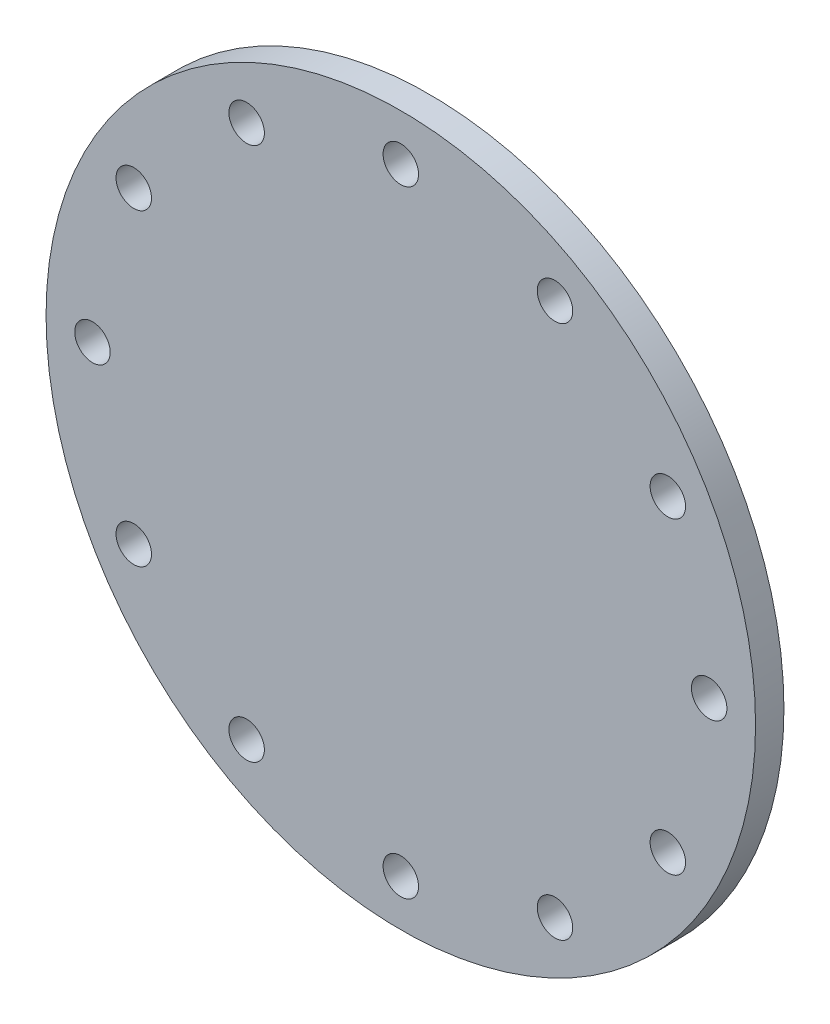
ISO-10303-21;
HEADER;
FILE_DESCRIPTION(('STEP AP214'),'2;1');
FILE_NAME('part.step','',(''),(''),'','','');
FILE_SCHEMA(('AUTOMOTIVE_DESIGN { 1 0 10303 214 1 1 1 1 }'));
ENDSEC;
DATA;
#1=APPLICATION_CONTEXT('core data for automotive mechanical design processes');
#2=APPLICATION_PROTOCOL_DEFINITION('international standard','automotive_design',2000,#1);
#3=PRODUCT_CONTEXT('',#1,'mechanical');
#4=PRODUCT('Part','Part','',(#3));
#5=PRODUCT_RELATED_PRODUCT_CATEGORY('part','',(#4));
#6=PRODUCT_DEFINITION_FORMATION('','',#4);
#7=PRODUCT_DEFINITION_CONTEXT('part definition',#1,'design');
#8=PRODUCT_DEFINITION('design','',#6,#7);
#9=PRODUCT_DEFINITION_SHAPE('','',#8);
#10=(LENGTH_UNIT() NAMED_UNIT(*) SI_UNIT(.MILLI.,.METRE.));
#11=(NAMED_UNIT(*) PLANE_ANGLE_UNIT() SI_UNIT($,.RADIAN.));
#12=(NAMED_UNIT(*) SI_UNIT($,.STERADIAN.) SOLID_ANGLE_UNIT());
#13=UNCERTAINTY_MEASURE_WITH_UNIT(LENGTH_MEASURE(1.E-05),#10,'distance_accuracy_value','');
#14=(GEOMETRIC_REPRESENTATION_CONTEXT(3) GLOBAL_UNCERTAINTY_ASSIGNED_CONTEXT((#13)) GLOBAL_UNIT_ASSIGNED_CONTEXT((#10,
#11,#12)) REPRESENTATION_CONTEXT('',''));
#15=CARTESIAN_POINT('',(0.,0.,0.));
#16=DIRECTION('',(0.,0.,1.));
#17=DIRECTION('',(1.,0.,0.));
#18=AXIS2_PLACEMENT_3D('',#15,#16,#17);
#19=CARTESIAN_POINT('',(0.,0.,20.));
#20=DIRECTION('',(0.,0.,1.));
#21=DIRECTION('',(1.,0.,0.));
#22=AXIS2_PLACEMENT_3D('',#19,#20,#21);
#23=PLANE('',#22);
#24=CARTESIAN_POINT('',(-188.179861477865,108.645693680294,20.));
#25=DIRECTION('',(0.,0.,1.));
#26=DIRECTION('',(1.,0.,0.));
#27=AXIS2_PLACEMENT_3D('',#24,#25,#26);
#28=CIRCLE('',#27,12.5000000000251);
#29=CARTESIAN_POINT('',(-175.67986147784,108.645693680294,20.));
#30=VERTEX_POINT('',#29);
#31=EDGE_CURVE('E100',#30,#30,#28,.T.);
#32=ORIENTED_EDGE('',*,*,#31,.F.);
#33=EDGE_LOOP('',(#32));
#34=FACE_BOUND('',#33,.T.);
#35=CARTESIAN_POINT('',(-188.179861477834,-108.645693680347,20.));
#36=DIRECTION('',(0.,0.,1.));
#37=DIRECTION('',(1.,0.,0.));
#38=AXIS2_PLACEMENT_3D('',#35,#36,#37);
#39=CIRCLE('',#38,12.500000000054);
#40=CARTESIAN_POINT('',(-175.67986147778,-108.645693680347,20.));
#41=VERTEX_POINT('',#40);
#42=EDGE_CURVE('E88',#41,#41,#39,.T.);
#43=ORIENTED_EDGE('',*,*,#42,.F.);
#44=EDGE_LOOP('',(#43));
#45=FACE_BOUND('',#44,.T.);
#46=CARTESIAN_POINT('',(6.16793325929702E-11,-217.291387360641,20.));
#47=DIRECTION('',(0.,0.,1.));
#48=DIRECTION('',(1.,0.,0.));
#49=AXIS2_PLACEMENT_3D('',#46,#47,#48);
#50=CIRCLE('',#49,12.5000000000604);
#51=CARTESIAN_POINT('',(12.5000000001221,-217.291387360641,20.));
#52=VERTEX_POINT('',#51);
#53=EDGE_CURVE('E76',#52,#52,#50,.T.);
#54=ORIENTED_EDGE('',*,*,#53,.F.);
#55=EDGE_LOOP('',(#54));
#56=FACE_BOUND('',#55,.T.);
#57=CARTESIAN_POINT('',(188.179861477926,-108.645693680294,20.));
#58=DIRECTION('',(0.,0.,1.));
#59=DIRECTION('',(1.,0.,0.));
#60=AXIS2_PLACEMENT_3D('',#57,#58,#59);
#61=CIRCLE('',#60,12.5000000000374);
#62=CARTESIAN_POINT('',(200.679861477964,-108.645693680294,20.));
#63=VERTEX_POINT('',#62);
#64=EDGE_CURVE('E64',#63,#63,#61,.T.);
#65=ORIENTED_EDGE('',*,*,#64,.F.);
#66=EDGE_LOOP('',(#65));
#67=FACE_BOUND('',#66,.T.);
#68=CARTESIAN_POINT('',(188.179861477895,108.645693680347,20.));
#69=DIRECTION('',(0.,0.,1.));
#70=DIRECTION('',(1.,0.,0.));
#71=AXIS2_PLACEMENT_3D('',#68,#69,#70);
#72=CIRCLE('',#71,12.5000000000074);
#73=CARTESIAN_POINT('',(200.679861477903,108.645693680347,20.));
#74=VERTEX_POINT('',#73);
#75=EDGE_CURVE('E52',#74,#74,#72,.T.);
#76=ORIENTED_EDGE('',*,*,#75,.F.);
#77=EDGE_LOOP('',(#76));
#78=FACE_BOUND('',#77,.T.);
#79=CARTESIAN_POINT('',(0.,217.291387360641,20.));
#80=DIRECTION('',(0.,0.,1.));
#81=DIRECTION('',(1.,0.,0.));
#82=AXIS2_PLACEMENT_3D('',#79,#80,#81);
#83=CIRCLE('',#82,12.5);
#84=CARTESIAN_POINT('',(12.5,217.291387360641,20.));
#85=VERTEX_POINT('',#84);
#86=EDGE_CURVE('E41',#85,#85,#83,.T.);
#87=ORIENTED_EDGE('',*,*,#86,.F.);
#88=EDGE_LOOP('',(#87));
#89=FACE_BOUND('',#88,.T.);
#90=CARTESIAN_POINT('',(0.,0.,20.));
#91=DIRECTION('',(0.,0.,1.));
#92=DIRECTION('',(1.,0.,0.));
#93=AXIS2_PLACEMENT_3D('',#90,#91,#92);
#94=CIRCLE('',#93,250.);
#95=CARTESIAN_POINT('',(250.,0.,20.));
#96=VERTEX_POINT('',#95);
#97=EDGE_CURVE('E10',#96,#96,#94,.T.);
#98=ORIENTED_EDGE('',*,*,#97,.T.);
#99=EDGE_LOOP('',(#98));
#100=FACE_BOUND('',#99,.T.);
#101=CARTESIAN_POINT('',(108.645693680325,188.179861477895,20.));
#102=DIRECTION('',(0.,0.,1.));
#103=DIRECTION('',(1.,0.,0.));
#104=AXIS2_PLACEMENT_3D('',#101,#102,#103);
#105=CIRCLE('',#104,12.4999999999996);
#106=CARTESIAN_POINT('',(121.145693680324,188.179861477895,20.));
#107=VERTEX_POINT('',#106);
#108=EDGE_CURVE('E46',#107,#107,#105,.T.);
#109=ORIENTED_EDGE('',*,*,#108,.F.);
#110=EDGE_LOOP('',(#109));
#111=FACE_BOUND('',#110,.T.);
#112=CARTESIAN_POINT('',(217.291387360672,3.08390475861655E-11,20.));
#113=DIRECTION('',(0.,0.,1.));
#114=DIRECTION('',(1.,0.,0.));
#115=AXIS2_PLACEMENT_3D('',#112,#113,#114);
#116=CIRCLE('',#115,12.5000000000212);
#117=CARTESIAN_POINT('',(229.791387360693,3.08390475861655E-11,20.));
#118=VERTEX_POINT('',#117);
#119=EDGE_CURVE('E58',#118,#118,#116,.T.);
#120=ORIENTED_EDGE('',*,*,#119,.F.);
#121=EDGE_LOOP('',(#120));
#122=FACE_BOUND('',#121,.T.);
#123=CARTESIAN_POINT('',(108.645693680378,-188.179861477865,20.));
#124=DIRECTION('',(0.,0.,1.));
#125=DIRECTION('',(1.,0.,0.));
#126=AXIS2_PLACEMENT_3D('',#123,#124,#125);
#127=CIRCLE('',#126,12.5000000000518);
#128=CARTESIAN_POINT('',(121.14569368043,-188.179861477865,20.));
#129=VERTEX_POINT('',#128);
#130=EDGE_CURVE('E70',#129,#129,#127,.T.);
#131=ORIENTED_EDGE('',*,*,#130,.F.);
#132=EDGE_LOOP('',(#131));
#133=FACE_BOUND('',#132,.T.);
#134=CARTESIAN_POINT('',(-108.645693680263,-188.179861477895,20.));
#135=DIRECTION('',(0.,0.,1.));
#136=DIRECTION('',(1.,0.,0.));
#137=AXIS2_PLACEMENT_3D('',#134,#135,#136);
#138=CIRCLE('',#137,12.5000000000613);
#139=CARTESIAN_POINT('',(-96.1456936802016,-188.179861477895,20.));
#140=VERTEX_POINT('',#139);
#141=EDGE_CURVE('E82',#140,#140,#138,.T.);
#142=ORIENTED_EDGE('',*,*,#141,.F.);
#143=EDGE_LOOP('',(#142));
#144=FACE_BOUND('',#143,.T.);
#145=CARTESIAN_POINT('',(-217.29138736061,-3.08656581063668E-11,20.));
#146=DIRECTION('',(0.,0.,1.));
#147=DIRECTION('',(1.,0.,0.));
#148=AXIS2_PLACEMENT_3D('',#145,#146,#147);
#149=CIRCLE('',#148,12.5000000000407);
#150=CARTESIAN_POINT('',(-204.791387360569,-3.08656581063668E-11,20.));
#151=VERTEX_POINT('',#150);
#152=EDGE_CURVE('E94',#151,#151,#149,.T.);
#153=ORIENTED_EDGE('',*,*,#152,.F.);
#154=EDGE_LOOP('',(#153));
#155=FACE_BOUND('',#154,.T.);
#156=CARTESIAN_POINT('',(-108.645693680316,188.179861477865,20.));
#157=DIRECTION('',(0.,0.,1.));
#158=DIRECTION('',(1.,0.,0.));
#159=AXIS2_PLACEMENT_3D('',#156,#157,#158);
#160=CIRCLE('',#159,12.5000000000112);
#161=CARTESIAN_POINT('',(-96.1456936803053,188.179861477865,20.));
#162=VERTEX_POINT('',#161);
#163=EDGE_CURVE('E106',#162,#162,#160,.T.);
#164=ORIENTED_EDGE('',*,*,#163,.F.);
#165=EDGE_LOOP('',(#164));
#166=FACE_BOUND('',#165,.T.);
#167=ADVANCED_FACE('F30',(#34,#45,#56,#67,#78,#89,#100,#111,#122,#133,#144,#155,#166),#23,.T.);
#168=CARTESIAN_POINT('',(0.,0.,0.));
#169=DIRECTION('',(0.,0.,1.));
#170=DIRECTION('',(1.,0.,0.));
#171=AXIS2_PLACEMENT_3D('',#168,#169,#170);
#172=PLANE('',#171);
#173=CARTESIAN_POINT('',(0.,0.,0.));
#174=DIRECTION('',(0.,0.,1.));
#175=DIRECTION('',(1.,0.,0.));
#176=AXIS2_PLACEMENT_3D('',#173,#174,#175);
#177=CIRCLE('',#176,250.);
#178=CARTESIAN_POINT('',(250.,0.,0.));
#179=VERTEX_POINT('',#178);
#180=EDGE_CURVE('E34',#179,#179,#177,.T.);
#181=ORIENTED_EDGE('',*,*,#180,.F.);
#182=EDGE_LOOP('',(#181));
#183=FACE_BOUND('',#182,.T.);
#184=CARTESIAN_POINT('',(0.,217.291387360641,0.));
#185=DIRECTION('',(0.,0.,1.));
#186=DIRECTION('',(1.,0.,0.));
#187=AXIS2_PLACEMENT_3D('',#184,#185,#186);
#188=CIRCLE('',#187,12.5);
#189=CARTESIAN_POINT('',(12.5,217.291387360641,0.));
#190=VERTEX_POINT('',#189);
#191=EDGE_CURVE('E43',#190,#190,#188,.T.);
#192=ORIENTED_EDGE('',*,*,#191,.T.);
#193=EDGE_LOOP('',(#192));
#194=FACE_BOUND('',#193,.T.);
#195=CARTESIAN_POINT('',(108.645693680325,188.179861477895,0.));
#196=DIRECTION('',(0.,0.,1.));
#197=DIRECTION('',(1.,0.,0.));
#198=AXIS2_PLACEMENT_3D('',#195,#196,#197);
#199=CIRCLE('',#198,12.4999999999996);
#200=CARTESIAN_POINT('',(121.145693680324,188.179861477895,0.));
#201=VERTEX_POINT('',#200);
#202=EDGE_CURVE('E49',#201,#201,#199,.T.);
#203=ORIENTED_EDGE('',*,*,#202,.T.);
#204=EDGE_LOOP('',(#203));
#205=FACE_BOUND('',#204,.T.);
#206=CARTESIAN_POINT('',(188.179861477895,108.645693680347,0.));
#207=DIRECTION('',(0.,0.,1.));
#208=DIRECTION('',(1.,0.,0.));
#209=AXIS2_PLACEMENT_3D('',#206,#207,#208);
#210=CIRCLE('',#209,12.5000000000074);
#211=CARTESIAN_POINT('',(200.679861477903,108.645693680347,0.));
#212=VERTEX_POINT('',#211);
#213=EDGE_CURVE('E55',#212,#212,#210,.T.);
#214=ORIENTED_EDGE('',*,*,#213,.T.);
#215=EDGE_LOOP('',(#214));
#216=FACE_BOUND('',#215,.T.);
#217=CARTESIAN_POINT('',(217.291387360672,3.08390475861655E-11,0.));
#218=DIRECTION('',(0.,0.,1.));
#219=DIRECTION('',(1.,0.,0.));
#220=AXIS2_PLACEMENT_3D('',#217,#218,#219);
#221=CIRCLE('',#220,12.5000000000212);
#222=CARTESIAN_POINT('',(229.791387360693,3.08390475861655E-11,0.));
#223=VERTEX_POINT('',#222);
#224=EDGE_CURVE('E61',#223,#223,#221,.T.);
#225=ORIENTED_EDGE('',*,*,#224,.T.);
#226=EDGE_LOOP('',(#225));
#227=FACE_BOUND('',#226,.T.);
#228=CARTESIAN_POINT('',(188.179861477926,-108.645693680294,0.));
#229=DIRECTION('',(0.,0.,1.));
#230=DIRECTION('',(1.,0.,0.));
#231=AXIS2_PLACEMENT_3D('',#228,#229,#230);
#232=CIRCLE('',#231,12.5000000000374);
#233=CARTESIAN_POINT('',(200.679861477964,-108.645693680294,0.));
#234=VERTEX_POINT('',#233);
#235=EDGE_CURVE('E67',#234,#234,#232,.T.);
#236=ORIENTED_EDGE('',*,*,#235,.T.);
#237=EDGE_LOOP('',(#236));
#238=FACE_BOUND('',#237,.T.);
#239=CARTESIAN_POINT('',(108.645693680378,-188.179861477865,0.));
#240=DIRECTION('',(0.,0.,1.));
#241=DIRECTION('',(1.,0.,0.));
#242=AXIS2_PLACEMENT_3D('',#239,#240,#241);
#243=CIRCLE('',#242,12.5000000000518);
#244=CARTESIAN_POINT('',(121.14569368043,-188.179861477865,0.));
#245=VERTEX_POINT('',#244);
#246=EDGE_CURVE('E73',#245,#245,#243,.T.);
#247=ORIENTED_EDGE('',*,*,#246,.T.);
#248=EDGE_LOOP('',(#247));
#249=FACE_BOUND('',#248,.T.);
#250=CARTESIAN_POINT('',(6.16793325929702E-11,-217.291387360641,0.));
#251=DIRECTION('',(0.,0.,1.));
#252=DIRECTION('',(1.,0.,0.));
#253=AXIS2_PLACEMENT_3D('',#250,#251,#252);
#254=CIRCLE('',#253,12.5000000000604);
#255=CARTESIAN_POINT('',(12.5000000001221,-217.291387360641,0.));
#256=VERTEX_POINT('',#255);
#257=EDGE_CURVE('E79',#256,#256,#254,.T.);
#258=ORIENTED_EDGE('',*,*,#257,.T.);
#259=EDGE_LOOP('',(#258));
#260=FACE_BOUND('',#259,.T.);
#261=CARTESIAN_POINT('',(-108.645693680263,-188.179861477895,0.));
#262=DIRECTION('',(0.,0.,1.));
#263=DIRECTION('',(1.,0.,0.));
#264=AXIS2_PLACEMENT_3D('',#261,#262,#263);
#265=CIRCLE('',#264,12.5000000000613);
#266=CARTESIAN_POINT('',(-96.1456936802016,-188.179861477895,0.));
#267=VERTEX_POINT('',#266);
#268=EDGE_CURVE('E85',#267,#267,#265,.T.);
#269=ORIENTED_EDGE('',*,*,#268,.T.);
#270=EDGE_LOOP('',(#269));
#271=FACE_BOUND('',#270,.T.);
#272=CARTESIAN_POINT('',(-188.179861477834,-108.645693680347,0.));
#273=DIRECTION('',(0.,0.,1.));
#274=DIRECTION('',(1.,0.,0.));
#275=AXIS2_PLACEMENT_3D('',#272,#273,#274);
#276=CIRCLE('',#275,12.500000000054);
#277=CARTESIAN_POINT('',(-175.67986147778,-108.645693680347,0.));
#278=VERTEX_POINT('',#277);
#279=EDGE_CURVE('E91',#278,#278,#276,.T.);
#280=ORIENTED_EDGE('',*,*,#279,.T.);
#281=EDGE_LOOP('',(#280));
#282=FACE_BOUND('',#281,.T.);
#283=CARTESIAN_POINT('',(-217.29138736061,-3.08656581063668E-11,0.));
#284=DIRECTION('',(0.,0.,1.));
#285=DIRECTION('',(1.,0.,0.));
#286=AXIS2_PLACEMENT_3D('',#283,#284,#285);
#287=CIRCLE('',#286,12.5000000000407);
#288=CARTESIAN_POINT('',(-204.791387360569,-3.08656581063668E-11,0.));
#289=VERTEX_POINT('',#288);
#290=EDGE_CURVE('E97',#289,#289,#287,.T.);
#291=ORIENTED_EDGE('',*,*,#290,.T.);
#292=EDGE_LOOP('',(#291));
#293=FACE_BOUND('',#292,.T.);
#294=CARTESIAN_POINT('',(-188.179861477865,108.645693680294,0.));
#295=DIRECTION('',(0.,0.,1.));
#296=DIRECTION('',(1.,0.,0.));
#297=AXIS2_PLACEMENT_3D('',#294,#295,#296);
#298=CIRCLE('',#297,12.5000000000251);
#299=CARTESIAN_POINT('',(-175.67986147784,108.645693680294,0.));
#300=VERTEX_POINT('',#299);
#301=EDGE_CURVE('E103',#300,#300,#298,.T.);
#302=ORIENTED_EDGE('',*,*,#301,.T.);
#303=EDGE_LOOP('',(#302));
#304=FACE_BOUND('',#303,.T.);
#305=CARTESIAN_POINT('',(-108.645693680316,188.179861477865,0.));
#306=DIRECTION('',(0.,0.,1.));
#307=DIRECTION('',(1.,0.,0.));
#308=AXIS2_PLACEMENT_3D('',#305,#306,#307);
#309=CIRCLE('',#308,12.5000000000112);
#310=CARTESIAN_POINT('',(-96.1456936803053,188.179861477865,0.));
#311=VERTEX_POINT('',#310);
#312=EDGE_CURVE('E109',#311,#311,#309,.T.);
#313=ORIENTED_EDGE('',*,*,#312,.T.);
#314=EDGE_LOOP('',(#313));
#315=FACE_BOUND('',#314,.T.);
#316=ADVANCED_FACE('F119',(#183,#194,#205,#216,#227,#238,#249,#260,#271,#282,#293,#304,#315),
#172,.F.);
#317=CARTESIAN_POINT('',(0.,0.,20.));
#318=DIRECTION('',(0.,0.,-1.));
#319=DIRECTION('',(-1.,0.,0.));
#320=AXIS2_PLACEMENT_3D('',#317,#318,#319);
#321=CYLINDRICAL_SURFACE('',#320,250.);
#322=ORIENTED_EDGE('',*,*,#97,.F.);
#323=EDGE_LOOP('',(#322));
#324=FACE_BOUND('',#323,.T.);
#325=ORIENTED_EDGE('',*,*,#180,.T.);
#326=EDGE_LOOP('',(#325));
#327=FACE_BOUND('',#326,.T.);
#328=ADVANCED_FACE('F32',(#324,#327),#321,.T.);
#329=CARTESIAN_POINT('',(0.,217.291387360641,20.));
#330=DIRECTION('',(0.,0.,-1.));
#331=DIRECTION('',(-1.,0.,0.));
#332=AXIS2_PLACEMENT_3D('',#329,#330,#331);
#333=CYLINDRICAL_SURFACE('',#332,12.5);
#334=ORIENTED_EDGE('',*,*,#86,.T.);
#335=EDGE_LOOP('',(#334));
#336=FACE_BOUND('',#335,.T.);
#337=ORIENTED_EDGE('',*,*,#191,.F.);
#338=EDGE_LOOP('',(#337));
#339=FACE_BOUND('',#338,.T.);
#340=ADVANCED_FACE('F129',(#336,#339),#333,.F.);
#341=CARTESIAN_POINT('',(108.645693680325,188.179861477895,20.));
#342=DIRECTION('',(0.,0.,-1.));
#343=DIRECTION('',(-1.,0.,0.));
#344=AXIS2_PLACEMENT_3D('',#341,#342,#343);
#345=CYLINDRICAL_SURFACE('',#344,12.4999999999996);
#346=ORIENTED_EDGE('',*,*,#108,.T.);
#347=EDGE_LOOP('',(#346));
#348=FACE_BOUND('',#347,.T.);
#349=ORIENTED_EDGE('',*,*,#202,.F.);
#350=EDGE_LOOP('',(#349));
#351=FACE_BOUND('',#350,.T.);
#352=ADVANCED_FACE('F132',(#348,#351),#345,.F.);
#353=CARTESIAN_POINT('',(188.179861477895,108.645693680347,20.));
#354=DIRECTION('',(0.,0.,-1.));
#355=DIRECTION('',(-1.,0.,0.));
#356=AXIS2_PLACEMENT_3D('',#353,#354,#355);
#357=CYLINDRICAL_SURFACE('',#356,12.5000000000074);
#358=ORIENTED_EDGE('',*,*,#75,.T.);
#359=EDGE_LOOP('',(#358));
#360=FACE_BOUND('',#359,.T.);
#361=ORIENTED_EDGE('',*,*,#213,.F.);
#362=EDGE_LOOP('',(#361));
#363=FACE_BOUND('',#362,.T.);
#364=ADVANCED_FACE('F136',(#360,#363),#357,.F.);
#365=CARTESIAN_POINT('',(217.291387360672,3.08390475861655E-11,20.));
#366=DIRECTION('',(0.,0.,-1.));
#367=DIRECTION('',(-1.,0.,0.));
#368=AXIS2_PLACEMENT_3D('',#365,#366,#367);
#369=CYLINDRICAL_SURFACE('',#368,12.5000000000212);
#370=ORIENTED_EDGE('',*,*,#119,.T.);
#371=EDGE_LOOP('',(#370));
#372=FACE_BOUND('',#371,.T.);
#373=ORIENTED_EDGE('',*,*,#224,.F.);
#374=EDGE_LOOP('',(#373));
#375=FACE_BOUND('',#374,.T.);
#376=ADVANCED_FACE('F140',(#372,#375),#369,.F.);
#377=CARTESIAN_POINT('',(188.179861477926,-108.645693680294,20.));
#378=DIRECTION('',(0.,0.,-1.));
#379=DIRECTION('',(-1.,0.,0.));
#380=AXIS2_PLACEMENT_3D('',#377,#378,#379);
#381=CYLINDRICAL_SURFACE('',#380,12.5000000000374);
#382=ORIENTED_EDGE('',*,*,#64,.T.);
#383=EDGE_LOOP('',(#382));
#384=FACE_BOUND('',#383,.T.);
#385=ORIENTED_EDGE('',*,*,#235,.F.);
#386=EDGE_LOOP('',(#385));
#387=FACE_BOUND('',#386,.T.);
#388=ADVANCED_FACE('F144',(#384,#387),#381,.F.);
#389=CARTESIAN_POINT('',(108.645693680378,-188.179861477865,20.));
#390=DIRECTION('',(0.,0.,-1.));
#391=DIRECTION('',(-1.,0.,0.));
#392=AXIS2_PLACEMENT_3D('',#389,#390,#391);
#393=CYLINDRICAL_SURFACE('',#392,12.5000000000518);
#394=ORIENTED_EDGE('',*,*,#130,.T.);
#395=EDGE_LOOP('',(#394));
#396=FACE_BOUND('',#395,.T.);
#397=ORIENTED_EDGE('',*,*,#246,.F.);
#398=EDGE_LOOP('',(#397));
#399=FACE_BOUND('',#398,.T.);
#400=ADVANCED_FACE('F148',(#396,#399),#393,.F.);
#401=CARTESIAN_POINT('',(6.16793325929702E-11,-217.291387360641,20.));
#402=DIRECTION('',(0.,0.,-1.));
#403=DIRECTION('',(-1.,0.,0.));
#404=AXIS2_PLACEMENT_3D('',#401,#402,#403);
#405=CYLINDRICAL_SURFACE('',#404,12.5000000000604);
#406=ORIENTED_EDGE('',*,*,#53,.T.);
#407=EDGE_LOOP('',(#406));
#408=FACE_BOUND('',#407,.T.);
#409=ORIENTED_EDGE('',*,*,#257,.F.);
#410=EDGE_LOOP('',(#409));
#411=FACE_BOUND('',#410,.T.);
#412=ADVANCED_FACE('F152',(#408,#411),#405,.F.);
#413=CARTESIAN_POINT('',(-108.645693680263,-188.179861477895,20.));
#414=DIRECTION('',(0.,0.,-1.));
#415=DIRECTION('',(-1.,0.,0.));
#416=AXIS2_PLACEMENT_3D('',#413,#414,#415);
#417=CYLINDRICAL_SURFACE('',#416,12.5000000000613);
#418=ORIENTED_EDGE('',*,*,#141,.T.);
#419=EDGE_LOOP('',(#418));
#420=FACE_BOUND('',#419,.T.);
#421=ORIENTED_EDGE('',*,*,#268,.F.);
#422=EDGE_LOOP('',(#421));
#423=FACE_BOUND('',#422,.T.);
#424=ADVANCED_FACE('F156',(#420,#423),#417,.F.);
#425=CARTESIAN_POINT('',(-188.179861477834,-108.645693680347,20.));
#426=DIRECTION('',(0.,0.,-1.));
#427=DIRECTION('',(-1.,0.,0.));
#428=AXIS2_PLACEMENT_3D('',#425,#426,#427);
#429=CYLINDRICAL_SURFACE('',#428,12.500000000054);
#430=ORIENTED_EDGE('',*,*,#42,.T.);
#431=EDGE_LOOP('',(#430));
#432=FACE_BOUND('',#431,.T.);
#433=ORIENTED_EDGE('',*,*,#279,.F.);
#434=EDGE_LOOP('',(#433));
#435=FACE_BOUND('',#434,.T.);
#436=ADVANCED_FACE('F160',(#432,#435),#429,.F.);
#437=CARTESIAN_POINT('',(-217.29138736061,-3.08656581063668E-11,20.));
#438=DIRECTION('',(0.,0.,-1.));
#439=DIRECTION('',(-1.,0.,0.));
#440=AXIS2_PLACEMENT_3D('',#437,#438,#439);
#441=CYLINDRICAL_SURFACE('',#440,12.5000000000407);
#442=ORIENTED_EDGE('',*,*,#152,.T.);
#443=EDGE_LOOP('',(#442));
#444=FACE_BOUND('',#443,.T.);
#445=ORIENTED_EDGE('',*,*,#290,.F.);
#446=EDGE_LOOP('',(#445));
#447=FACE_BOUND('',#446,.T.);
#448=ADVANCED_FACE('F164',(#444,#447),#441,.F.);
#449=CARTESIAN_POINT('',(-188.179861477865,108.645693680294,20.));
#450=DIRECTION('',(0.,0.,-1.));
#451=DIRECTION('',(-1.,0.,0.));
#452=AXIS2_PLACEMENT_3D('',#449,#450,#451);
#453=CYLINDRICAL_SURFACE('',#452,12.5000000000251);
#454=ORIENTED_EDGE('',*,*,#31,.T.);
#455=EDGE_LOOP('',(#454));
#456=FACE_BOUND('',#455,.T.);
#457=ORIENTED_EDGE('',*,*,#301,.F.);
#458=EDGE_LOOP('',(#457));
#459=FACE_BOUND('',#458,.T.);
#460=ADVANCED_FACE('F168',(#456,#459),#453,.F.);
#461=CARTESIAN_POINT('',(-108.645693680316,188.179861477865,20.));
#462=DIRECTION('',(0.,0.,-1.));
#463=DIRECTION('',(-1.,0.,0.));
#464=AXIS2_PLACEMENT_3D('',#461,#462,#463);
#465=CYLINDRICAL_SURFACE('',#464,12.5000000000112);
#466=ORIENTED_EDGE('',*,*,#163,.T.);
#467=EDGE_LOOP('',(#466));
#468=FACE_BOUND('',#467,.T.);
#469=ORIENTED_EDGE('',*,*,#312,.F.);
#470=EDGE_LOOP('',(#469));
#471=FACE_BOUND('',#470,.T.);
#472=ADVANCED_FACE('F115',(#468,#471),#465,.F.);
#473=CLOSED_SHELL('',(#167,#316,#328,#340,#352,#364,#376,#388,#400,#412,#424,#436,#448,#460,#472));
#474=MANIFOLD_SOLID_BREP('B2',#473);
#475=ADVANCED_BREP_SHAPE_REPRESENTATION('',(#18,#474),#14);
#476=SHAPE_DEFINITION_REPRESENTATION(#9,#475);
ENDSEC;
END-ISO-10303-21;
